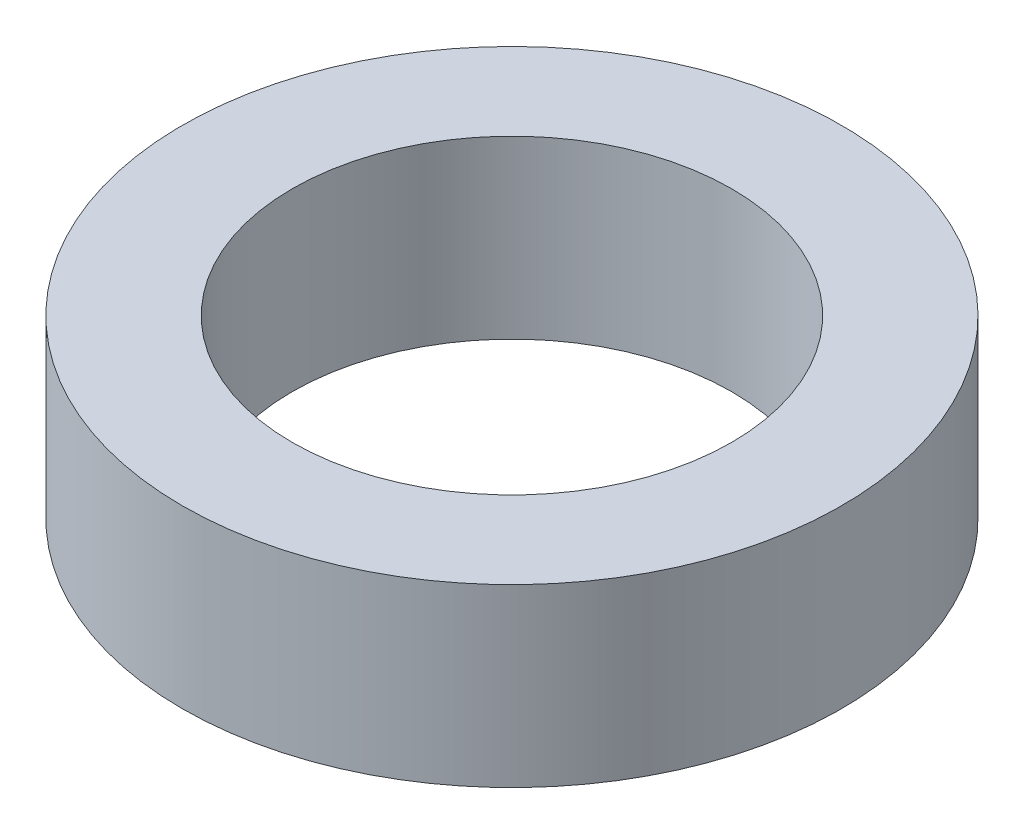
ISO-10303-21;
HEADER;
FILE_DESCRIPTION(('STEP AP214'),'2;1');
FILE_NAME('part.step','',(''),(''),'','','');
FILE_SCHEMA(('AUTOMOTIVE_DESIGN { 1 0 10303 214 1 1 1 1 }'));
ENDSEC;
DATA;
#1=APPLICATION_CONTEXT('core data for automotive mechanical design processes');
#2=APPLICATION_PROTOCOL_DEFINITION('international standard','automotive_design',2000,#1);
#3=PRODUCT_CONTEXT('',#1,'mechanical');
#4=PRODUCT('Part','Part','',(#3));
#5=PRODUCT_RELATED_PRODUCT_CATEGORY('part','',(#4));
#6=PRODUCT_DEFINITION_FORMATION('','',#4);
#7=PRODUCT_DEFINITION_CONTEXT('part definition',#1,'design');
#8=PRODUCT_DEFINITION('design','',#6,#7);
#9=PRODUCT_DEFINITION_SHAPE('','',#8);
#10=(LENGTH_UNIT() NAMED_UNIT(*) SI_UNIT(.MILLI.,.METRE.));
#11=(NAMED_UNIT(*) PLANE_ANGLE_UNIT() SI_UNIT($,.RADIAN.));
#12=(NAMED_UNIT(*) SI_UNIT($,.STERADIAN.) SOLID_ANGLE_UNIT());
#13=UNCERTAINTY_MEASURE_WITH_UNIT(LENGTH_MEASURE(1.E-05),#10,'distance_accuracy_value','');
#14=(GEOMETRIC_REPRESENTATION_CONTEXT(3) GLOBAL_UNCERTAINTY_ASSIGNED_CONTEXT((#13)) GLOBAL_UNIT_ASSIGNED_CONTEXT((#10,
#11,#12)) REPRESENTATION_CONTEXT('',''));
#15=CARTESIAN_POINT('',(0.,0.,0.));
#16=DIRECTION('',(0.,0.,1.));
#17=DIRECTION('',(1.,0.,0.));
#18=AXIS2_PLACEMENT_3D('',#15,#16,#17);
#19=CARTESIAN_POINT('',(0.,2.000000064,0.));
#20=DIRECTION('',(0.,1.,0.));
#21=DIRECTION('',(0.,0.,1.));
#22=AXIS2_PLACEMENT_3D('',#19,#20,#21);
#23=PLANE('',#22);
#24=CARTESIAN_POINT('',(0.,2.000000064,0.));
#25=DIRECTION('',(0.,1.,0.));
#26=DIRECTION('',(0.,0.,1.));
#27=AXIS2_PLACEMENT_3D('',#24,#25,#26);
#28=CIRCLE('',#27,7.499999986);
#29=CARTESIAN_POINT('',(0.,2.000000064,7.499999986));
#30=VERTEX_POINT('',#29);
#31=EDGE_CURVE('E10',#30,#30,#28,.T.);
#32=ORIENTED_EDGE('',*,*,#31,.T.);
#33=EDGE_LOOP('',(#32));
#34=FACE_BOUND('',#33,.T.);
#35=CARTESIAN_POINT('',(0.,2.000000064,0.));
#36=DIRECTION('',(0.,1.,0.));
#37=DIRECTION('',(0.,0.,1.));
#38=AXIS2_PLACEMENT_3D('',#35,#36,#37);
#39=CIRCLE('',#38,5.000000033);
#40=CARTESIAN_POINT('',(0.,2.000000064,5.000000033));
#41=VERTEX_POINT('',#40);
#42=EDGE_CURVE('E46',#41,#41,#39,.T.);
#43=ORIENTED_EDGE('',*,*,#42,.F.);
#44=EDGE_LOOP('',(#43));
#45=FACE_BOUND('',#44,.T.);
#46=ADVANCED_FACE('F32',(#34,#45),#23,.T.);
#47=CARTESIAN_POINT('',(0.,-2.000000064,0.));
#48=DIRECTION('',(0.,1.,0.));
#49=DIRECTION('',(0.,0.,1.));
#50=AXIS2_PLACEMENT_3D('',#47,#48,#49);
#51=PLANE('',#50);
#52=CARTESIAN_POINT('',(0.,-2.000000064,0.));
#53=DIRECTION('',(0.,1.,0.));
#54=DIRECTION('',(0.,0.,1.));
#55=AXIS2_PLACEMENT_3D('',#52,#53,#54);
#56=CIRCLE('',#55,7.499999986);
#57=CARTESIAN_POINT('',(0.,-2.000000064,7.499999986));
#58=VERTEX_POINT('',#57);
#59=EDGE_CURVE('E36',#58,#58,#56,.T.);
#60=ORIENTED_EDGE('',*,*,#59,.F.);
#61=EDGE_LOOP('',(#60));
#62=FACE_BOUND('',#61,.T.);
#63=CARTESIAN_POINT('',(0.,-2.000000064,0.));
#64=DIRECTION('',(0.,1.,0.));
#65=DIRECTION('',(0.,0.,1.));
#66=AXIS2_PLACEMENT_3D('',#63,#64,#65);
#67=CIRCLE('',#66,5.000000033);
#68=CARTESIAN_POINT('',(0.,-2.000000064,5.000000033));
#69=VERTEX_POINT('',#68);
#70=EDGE_CURVE('E48',#69,#69,#67,.T.);
#71=ORIENTED_EDGE('',*,*,#70,.T.);
#72=EDGE_LOOP('',(#71));
#73=FACE_BOUND('',#72,.T.);
#74=ADVANCED_FACE('F59',(#62,#73),#51,.F.);
#75=CARTESIAN_POINT('',(0.,2.000000064,0.));
#76=DIRECTION('',(0.,-1.,0.));
#77=DIRECTION('',(0.,0.,-1.));
#78=AXIS2_PLACEMENT_3D('',#75,#76,#77);
#79=CYLINDRICAL_SURFACE('',#78,7.499999986);
#80=ORIENTED_EDGE('',*,*,#31,.F.);
#81=EDGE_LOOP('',(#80));
#82=FACE_BOUND('',#81,.T.);
#83=ORIENTED_EDGE('',*,*,#59,.T.);
#84=EDGE_LOOP('',(#83));
#85=FACE_BOUND('',#84,.T.);
#86=ADVANCED_FACE('F34',(#82,#85),#79,.T.);
#87=CARTESIAN_POINT('',(0.,2.000000064,0.));
#88=DIRECTION('',(0.,-1.,0.));
#89=DIRECTION('',(0.,0.,-1.));
#90=AXIS2_PLACEMENT_3D('',#87,#88,#89);
#91=CYLINDRICAL_SURFACE('',#90,5.000000033);
#92=ORIENTED_EDGE('',*,*,#42,.T.);
#93=EDGE_LOOP('',(#92));
#94=FACE_BOUND('',#93,.T.);
#95=ORIENTED_EDGE('',*,*,#70,.F.);
#96=EDGE_LOOP('',(#95));
#97=FACE_BOUND('',#96,.T.);
#98=ADVANCED_FACE('F55',(#94,#97),#91,.F.);
#99=CLOSED_SHELL('',(#46,#74,#86,#98));
#100=MANIFOLD_SOLID_BREP('B2',#99);
#101=ADVANCED_BREP_SHAPE_REPRESENTATION('',(#18,#100),#14);
#102=SHAPE_DEFINITION_REPRESENTATION(#9,#101);
ENDSEC;
END-ISO-10303-21;
